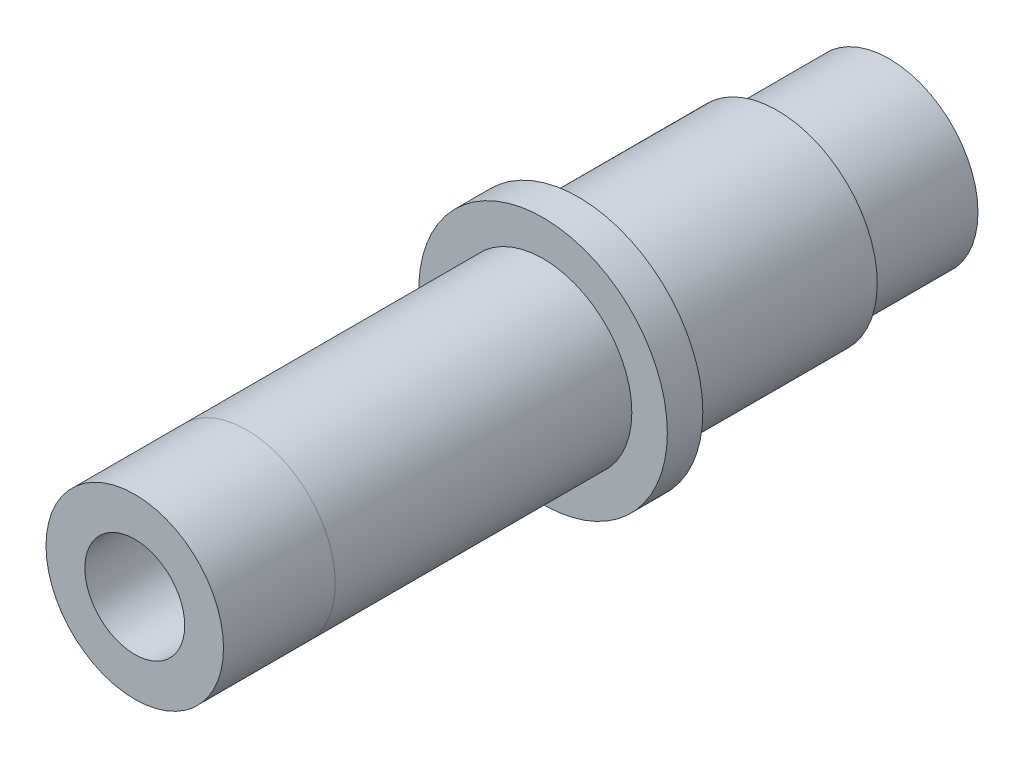
ISO-10303-21;
HEADER;
FILE_DESCRIPTION(('STEP AP214'),'2;1');
FILE_NAME('part.step','',(''),(''),'','','');
FILE_SCHEMA(('AUTOMOTIVE_DESIGN { 1 0 10303 214 1 1 1 1 }'));
ENDSEC;
DATA;
#1=APPLICATION_CONTEXT('core data for automotive mechanical design processes');
#2=APPLICATION_PROTOCOL_DEFINITION('international standard','automotive_design',2000,#1);
#3=PRODUCT_CONTEXT('',#1,'mechanical');
#4=PRODUCT('Part','Part','',(#3));
#5=PRODUCT_RELATED_PRODUCT_CATEGORY('part','',(#4));
#6=PRODUCT_DEFINITION_FORMATION('','',#4);
#7=PRODUCT_DEFINITION_CONTEXT('part definition',#1,'design');
#8=PRODUCT_DEFINITION('design','',#6,#7);
#9=PRODUCT_DEFINITION_SHAPE('','',#8);
#10=(LENGTH_UNIT() NAMED_UNIT(*) SI_UNIT(.MILLI.,.METRE.));
#11=(NAMED_UNIT(*) PLANE_ANGLE_UNIT() SI_UNIT($,.RADIAN.));
#12=(NAMED_UNIT(*) SI_UNIT($,.STERADIAN.) SOLID_ANGLE_UNIT());
#13=UNCERTAINTY_MEASURE_WITH_UNIT(LENGTH_MEASURE(1.E-05),#10,'distance_accuracy_value','');
#14=(GEOMETRIC_REPRESENTATION_CONTEXT(3) GLOBAL_UNCERTAINTY_ASSIGNED_CONTEXT((#13)) GLOBAL_UNIT_ASSIGNED_CONTEXT((#10,
#11,#12)) REPRESENTATION_CONTEXT('',''));
#15=CARTESIAN_POINT('',(0.,0.,0.));
#16=DIRECTION('',(0.,0.,1.));
#17=DIRECTION('',(1.,0.,0.));
#18=AXIS2_PLACEMENT_3D('',#15,#16,#17);
#19=CARTESIAN_POINT('',(0.,0.,-23.495));
#20=DIRECTION('',(0.,0.,1.));
#21=DIRECTION('',(1.,0.,0.));
#22=AXIS2_PLACEMENT_3D('',#19,#20,#21);
#23=CYLINDRICAL_SURFACE('',#22,6.35);
#24=CARTESIAN_POINT('',(0.,0.,30.48));
#25=DIRECTION('',(0.,0.,1.));
#26=DIRECTION('',(1.,0.,0.));
#27=AXIS2_PLACEMENT_3D('',#24,#25,#26);
#28=CIRCLE('',#27,6.35);
#29=CARTESIAN_POINT('',(6.35,0.,30.48));
#30=VERTEX_POINT('',#29);
#31=EDGE_CURVE('E81',#30,#30,#28,.T.);
#32=ORIENTED_EDGE('',*,*,#31,.F.);
#33=EDGE_LOOP('',(#32));
#34=FACE_BOUND('',#33,.T.);
#35=CARTESIAN_POINT('',(0.,0.,22.48));
#36=DIRECTION('',(0.,0.,-1.));
#37=DIRECTION('',(-1.,0.,0.));
#38=AXIS2_PLACEMENT_3D('',#35,#36,#37);
#39=CIRCLE('',#38,6.35);
#40=CARTESIAN_POINT('',(0.,6.35,22.48));
#41=VERTEX_POINT('',#40);
#42=CARTESIAN_POINT('',(0.,-6.35,22.48));
#43=VERTEX_POINT('',#42);
#44=EDGE_CURVE('E67',#41,#43,#39,.F.);
#45=ORIENTED_EDGE('',*,*,#44,.T.);
#46=EDGE_CURVE('E59',#43,#41,#39,.F.);
#47=ORIENTED_EDGE('',*,*,#46,.T.);
#48=EDGE_LOOP('',(#45,#47));
#49=FACE_BOUND('',#48,.T.);
#50=ADVANCED_FACE('F49',(#34,#49),#23,.T.);
#51=ORIENTED_EDGE('',*,*,#46,.F.);
#52=ORIENTED_EDGE('',*,*,#44,.F.);
#53=EDGE_LOOP('',(#51,#52));
#54=FACE_BOUND('',#53,.T.);
#55=CARTESIAN_POINT('',(0.,0.,1.27));
#56=DIRECTION('',(0.,0.,1.));
#57=DIRECTION('',(1.,0.,0.));
#58=AXIS2_PLACEMENT_3D('',#55,#56,#57);
#59=CIRCLE('',#58,6.35);
#60=CARTESIAN_POINT('',(6.35,0.,1.27));
#61=VERTEX_POINT('',#60);
#62=EDGE_CURVE('E72',#61,#61,#59,.F.);
#63=ORIENTED_EDGE('',*,*,#62,.F.);
#64=EDGE_LOOP('',(#63));
#65=FACE_BOUND('',#64,.T.);
#66=ADVANCED_FACE('F51',(#54,#65),#23,.T.);
#67=CARTESIAN_POINT('',(0.,0.,30.48));
#68=DIRECTION('',(0.,0.,1.));
#69=DIRECTION('',(1.,0.,0.));
#70=AXIS2_PLACEMENT_3D('',#67,#68,#69);
#71=PLANE('',#70);
#72=CARTESIAN_POINT('',(0.,0.,30.48));
#73=DIRECTION('',(0.,0.,1.));
#74=DIRECTION('',(1.,0.,0.));
#75=AXIS2_PLACEMENT_3D('',#72,#73,#74);
#76=CIRCLE('',#75,3.571875);
#77=CARTESIAN_POINT('',(3.571875,0.,30.48));
#78=VERTEX_POINT('',#77);
#79=EDGE_CURVE('E94',#78,#78,#76,.T.);
#80=ORIENTED_EDGE('',*,*,#79,.F.);
#81=EDGE_LOOP('',(#80));
#82=FACE_BOUND('',#81,.T.);
#83=ORIENTED_EDGE('',*,*,#31,.T.);
#84=EDGE_LOOP('',(#83));
#85=FACE_BOUND('',#84,.T.);
#86=ADVANCED_FACE('F110',(#82,#85),#71,.T.);
#87=CARTESIAN_POINT('',(0.,0.,1.27));
#88=DIRECTION('',(0.,0.,-1.));
#89=DIRECTION('',(-1.,0.,0.));
#90=AXIS2_PLACEMENT_3D('',#87,#88,#89);
#91=CYLINDRICAL_SURFACE('',#90,8.89);
#92=CARTESIAN_POINT('',(0.,0.,1.27));
#93=DIRECTION('',(0.,0.,1.));
#94=DIRECTION('',(1.,0.,0.));
#95=AXIS2_PLACEMENT_3D('',#92,#93,#94);
#96=CIRCLE('',#95,8.89);
#97=CARTESIAN_POINT('',(8.89,0.,1.27));
#98=VERTEX_POINT('',#97);
#99=EDGE_CURVE('E84',#98,#98,#96,.T.);
#100=ORIENTED_EDGE('',*,*,#99,.F.);
#101=EDGE_LOOP('',(#100));
#102=FACE_BOUND('',#101,.T.);
#103=CARTESIAN_POINT('',(0.,0.,-1.27));
#104=DIRECTION('',(0.,0.,1.));
#105=DIRECTION('',(1.,0.,0.));
#106=AXIS2_PLACEMENT_3D('',#103,#104,#105);
#107=CIRCLE('',#106,8.89);
#108=CARTESIAN_POINT('',(8.89,0.,-1.27));
#109=VERTEX_POINT('',#108);
#110=EDGE_CURVE('E85',#109,#109,#107,.T.);
#111=ORIENTED_EDGE('',*,*,#110,.T.);
#112=EDGE_LOOP('',(#111));
#113=FACE_BOUND('',#112,.T.);
#114=ADVANCED_FACE('F113',(#102,#113),#91,.T.);
#115=CARTESIAN_POINT('',(0.,0.,1.27));
#116=DIRECTION('',(0.,0.,1.));
#117=DIRECTION('',(1.,0.,0.));
#118=AXIS2_PLACEMENT_3D('',#115,#116,#117);
#119=PLANE('',#118);
#120=ORIENTED_EDGE('',*,*,#62,.T.);
#121=EDGE_LOOP('',(#120));
#122=FACE_BOUND('',#121,.T.);
#123=ORIENTED_EDGE('',*,*,#99,.T.);
#124=EDGE_LOOP('',(#123));
#125=FACE_BOUND('',#124,.T.);
#126=ADVANCED_FACE('F147',(#122,#125),#119,.T.);
#127=CARTESIAN_POINT('',(0.,0.,-1.27));
#128=DIRECTION('',(0.,0.,1.));
#129=DIRECTION('',(1.,0.,0.));
#130=AXIS2_PLACEMENT_3D('',#127,#128,#129);
#131=PLANE('',#130);
#132=CARTESIAN_POINT('',(0.,0.,-1.27));
#133=DIRECTION('',(0.,0.,1.));
#134=DIRECTION('',(1.,0.,0.));
#135=AXIS2_PLACEMENT_3D('',#132,#133,#134);
#136=CIRCLE('',#135,7.14375);
#137=CARTESIAN_POINT('',(7.14375,0.,-1.27));
#138=VERTEX_POINT('',#137);
#139=EDGE_CURVE('E53',#138,#138,#136,.T.);
#140=ORIENTED_EDGE('',*,*,#139,.T.);
#141=EDGE_LOOP('',(#140));
#142=FACE_BOUND('',#141,.T.);
#143=ORIENTED_EDGE('',*,*,#110,.F.);
#144=EDGE_LOOP('',(#143));
#145=FACE_BOUND('',#144,.T.);
#146=ADVANCED_FACE('F140',(#142,#145),#131,.F.);
#147=CARTESIAN_POINT('',(0.,0.,-15.495));
#148=DIRECTION('',(0.,0.,1.));
#149=DIRECTION('',(1.,0.,0.));
#150=AXIS2_PLACEMENT_3D('',#147,#148,#149);
#151=CYLINDRICAL_SURFACE('',#150,7.14375);
#152=CARTESIAN_POINT('',(0.,0.,-15.495));
#153=DIRECTION('',(0.,0.,1.));
#154=DIRECTION('',(1.,0.,0.));
#155=AXIS2_PLACEMENT_3D('',#152,#153,#154);
#156=CIRCLE('',#155,7.14375);
#157=CARTESIAN_POINT('',(7.14375,0.,-15.495));
#158=VERTEX_POINT('',#157);
#159=EDGE_CURVE('E90',#158,#158,#156,.T.);
#160=CARTESIAN_POINT('',(7.14375,0.,-15.495));
#161=CARTESIAN_POINT('',(7.14375,0.,-15.3468229166667));
#162=CARTESIAN_POINT('',(7.14375,0.,-15.1986458333333));
#163=CARTESIAN_POINT('',(7.14375,0.,-14.9022916666667));
#164=CARTESIAN_POINT('',(7.14375,0.,-14.7541145833333));
#165=CARTESIAN_POINT('',(7.14375,0.,-14.4577604166667));
#166=CARTESIAN_POINT('',(7.14375,0.,-14.3095833333333));
#167=CARTESIAN_POINT('',(7.14375,0.,-14.0132291666667));
#168=CARTESIAN_POINT('',(7.14375,0.,-13.8650520833333));
#169=CARTESIAN_POINT('',(7.14375,0.,-13.5686979166667));
#170=CARTESIAN_POINT('',(7.14375,0.,-13.4205208333333));
#171=CARTESIAN_POINT('',(7.14375,0.,-13.1241666666667));
#172=CARTESIAN_POINT('',(7.14375,0.,-12.9759895833333));
#173=CARTESIAN_POINT('',(7.14375,0.,-12.6796354166667));
#174=CARTESIAN_POINT('',(7.14375,0.,-12.5314583333333));
#175=CARTESIAN_POINT('',(7.14375,0.,-12.2351041666667));
#176=CARTESIAN_POINT('',(7.14375,0.,-12.0869270833333));
#177=CARTESIAN_POINT('',(7.14375,0.,-11.7905729166667));
#178=CARTESIAN_POINT('',(7.14375,0.,-11.6423958333333));
#179=CARTESIAN_POINT('',(7.14375,0.,-11.3460416666667));
#180=CARTESIAN_POINT('',(7.14375,0.,-11.1978645833333));
#181=CARTESIAN_POINT('',(7.14375,0.,-10.9015104166667));
#182=CARTESIAN_POINT('',(7.14375,0.,-10.7533333333333));
#183=CARTESIAN_POINT('',(7.14375,0.,-10.4569791666667));
#184=CARTESIAN_POINT('',(7.14375,0.,-10.3088020833333));
#185=CARTESIAN_POINT('',(7.14375,0.,-10.0124479166667));
#186=CARTESIAN_POINT('',(7.14375,0.,-9.86427083333334));
#187=CARTESIAN_POINT('',(7.14375,0.,-9.56791666666667));
#188=CARTESIAN_POINT('',(7.14375,0.,-9.41973958333334));
#189=CARTESIAN_POINT('',(7.14375,0.,-9.12338541666667));
#190=CARTESIAN_POINT('',(7.14375,0.,-8.97520833333334));
#191=CARTESIAN_POINT('',(7.14375,0.,-8.67885416666667));
#192=CARTESIAN_POINT('',(7.14375,0.,-8.53067708333334));
#193=CARTESIAN_POINT('',(7.14375,0.,-8.23432291666667));
#194=CARTESIAN_POINT('',(7.14375,0.,-8.08614583333334));
#195=CARTESIAN_POINT('',(7.14375,0.,-7.78979166666667));
#196=CARTESIAN_POINT('',(7.14375,0.,-7.64161458333334));
#197=CARTESIAN_POINT('',(7.14375,0.,-7.34526041666667));
#198=CARTESIAN_POINT('',(7.14375,0.,-7.19708333333334));
#199=CARTESIAN_POINT('',(7.14375,0.,-6.90072916666667));
#200=CARTESIAN_POINT('',(7.14375,0.,-6.75255208333334));
#201=CARTESIAN_POINT('',(7.14375,0.,-6.45619791666667));
#202=CARTESIAN_POINT('',(7.14375,0.,-6.30802083333334));
#203=CARTESIAN_POINT('',(7.14375,0.,-6.01166666666667));
#204=CARTESIAN_POINT('',(7.14375,0.,-5.86348958333333));
#205=CARTESIAN_POINT('',(7.14375,0.,-5.56713541666667));
#206=CARTESIAN_POINT('',(7.14375,0.,-5.41895833333334));
#207=CARTESIAN_POINT('',(7.14375,0.,-5.12260416666667));
#208=CARTESIAN_POINT('',(7.14375,0.,-4.97442708333334));
#209=CARTESIAN_POINT('',(7.14375,0.,-4.67807291666667));
#210=CARTESIAN_POINT('',(7.14375,0.,-4.52989583333334));
#211=CARTESIAN_POINT('',(7.14375,0.,-4.23354166666667));
#212=CARTESIAN_POINT('',(7.14375,0.,-4.08536458333334));
#213=CARTESIAN_POINT('',(7.14375,0.,-3.78901041666667));
#214=CARTESIAN_POINT('',(7.14375,0.,-3.64083333333334));
#215=CARTESIAN_POINT('',(7.14375,0.,-3.34447916666667));
#216=CARTESIAN_POINT('',(7.14375,0.,-3.19630208333334));
#217=CARTESIAN_POINT('',(7.14375,0.,-2.89994791666667));
#218=CARTESIAN_POINT('',(7.14375,0.,-2.75177083333334));
#219=CARTESIAN_POINT('',(7.14375,0.,-2.45541666666667));
#220=CARTESIAN_POINT('',(7.14375,0.,-2.30723958333334));
#221=CARTESIAN_POINT('',(7.14375,0.,-2.01088541666667));
#222=CARTESIAN_POINT('',(7.14375,0.,-1.86270833333333));
#223=CARTESIAN_POINT('',(7.14375,0.,-1.56635416666667));
#224=CARTESIAN_POINT('',(7.14375,0.,-1.41817708333334));
#225=CARTESIAN_POINT('',(7.14375,0.,-1.27));
#226=B_SPLINE_CURVE_WITH_KNOTS('',3,(#160,#161,#162,#163,#164,#165,#166,#167,#168,#169,#170,
#171,#172,#173,#174,#175,#176,#177,#178,#179,#180,#181,#182,#183,#184,#185,#186,#187,#188,#189,
#190,#191,#192,#193,#194,#195,#196,#197,#198,#199,#200,#201,#202,#203,#204,#205,#206,#207,#208,
#209,#210,#211,#212,#213,#214,#215,#216,#217,#218,#219,#220,#221,#222,#223,#224,#225),
.UNSPECIFIED.,.F.,.F.,(4,2,2,2,2,2,2,2,2,2,2,2,2,2,2,2,2,2,2,2,2,2,2,2,2,2,2,2,2,2,2,2,4),(0.,
0.44453125,0.889062499999999,1.33359375,1.778125,2.22265625,2.6671875,3.11171875,3.55625,
4.00078125,4.4453125,4.88984375,5.334375,5.77890625,6.2234375,6.66796875,7.1125,7.55703125,
8.0015625,8.44609375,8.890625,9.33515625,9.7796875,10.22421875,10.66875,11.11328125,11.5578125,
12.00234375,12.446875,12.89140625,13.3359375,13.78046875,14.225),.UNSPECIFIED.);
#227=EDGE_CURVE('BSEAM134',#158,#138,#226,.T.);
#228=ORIENTED_EDGE('',*,*,#159,.T.);
#229=ORIENTED_EDGE('',*,*,#139,.F.);
#230=ORIENTED_EDGE('',*,*,#227,.T.);
#231=ORIENTED_EDGE('',*,*,#227,.F.);
#232=EDGE_LOOP('',(#228,#230,#229,#231));
#233=FACE_BOUND('',#232,.T.);
#234=ADVANCED_FACE('F134',(#233),#151,.T.);
#235=CARTESIAN_POINT('',(0.,0.,-15.495));
#236=DIRECTION('',(0.,0.,1.));
#237=DIRECTION('',(1.,0.,0.));
#238=AXIS2_PLACEMENT_3D('',#235,#236,#237);
#239=PLANE('',#238);
#240=CARTESIAN_POINT('',(0.,0.,-15.495));
#241=DIRECTION('',(0.,0.,1.));
#242=DIRECTION('',(1.,0.,0.));
#243=AXIS2_PLACEMENT_3D('',#240,#241,#242);
#244=CIRCLE('',#243,6.35);
#245=CARTESIAN_POINT('',(6.35,0.,-15.495));
#246=VERTEX_POINT('',#245);
#247=EDGE_CURVE('E11',#246,#246,#244,.F.);
#248=ORIENTED_EDGE('',*,*,#247,.F.);
#249=EDGE_LOOP('',(#248));
#250=FACE_BOUND('',#249,.T.);
#251=ORIENTED_EDGE('',*,*,#159,.F.);
#252=EDGE_LOOP('',(#251));
#253=FACE_BOUND('',#252,.T.);
#254=ADVANCED_FACE('F128',(#250,#253),#239,.F.);
#255=CARTESIAN_POINT('',(0.,0.,-23.495));
#256=DIRECTION('',(0.,0.,1.));
#257=DIRECTION('',(1.,0.,0.));
#258=AXIS2_PLACEMENT_3D('',#255,#256,#257);
#259=PLANE('',#258);
#260=CARTESIAN_POINT('',(0.,0.,-23.495));
#261=DIRECTION('',(0.,0.,1.));
#262=DIRECTION('',(1.,0.,0.));
#263=AXIS2_PLACEMENT_3D('',#260,#261,#262);
#264=CIRCLE('',#263,3.571875);
#265=CARTESIAN_POINT('',(3.571875,0.,-23.495));
#266=VERTEX_POINT('',#265);
#267=EDGE_CURVE('E93',#266,#266,#264,.T.);
#268=ORIENTED_EDGE('',*,*,#267,.T.);
#269=EDGE_LOOP('',(#268));
#270=FACE_BOUND('',#269,.T.);
#271=CARTESIAN_POINT('',(0.,0.,-23.495));
#272=DIRECTION('',(0.,0.,1.));
#273=DIRECTION('',(1.,0.,0.));
#274=AXIS2_PLACEMENT_3D('',#271,#272,#273);
#275=CIRCLE('',#274,6.35);
#276=CARTESIAN_POINT('',(6.35,0.,-23.495));
#277=VERTEX_POINT('',#276);
#278=EDGE_CURVE('E76',#277,#277,#275,.T.);
#279=ORIENTED_EDGE('',*,*,#278,.F.);
#280=EDGE_LOOP('',(#279));
#281=FACE_BOUND('',#280,.T.);
#282=ADVANCED_FACE('F100',(#270,#281),#259,.F.);
#283=ORIENTED_EDGE('',*,*,#278,.T.);
#284=EDGE_LOOP('',(#283));
#285=FACE_BOUND('',#284,.T.);
#286=ORIENTED_EDGE('',*,*,#247,.T.);
#287=EDGE_LOOP('',(#286));
#288=FACE_BOUND('',#287,.T.);
#289=ADVANCED_FACE('F106',(#285,#288),#23,.T.);
#290=CARTESIAN_POINT('',(0.,0.,-23.495));
#291=DIRECTION('',(0.,0.,1.));
#292=DIRECTION('',(1.,0.,0.));
#293=AXIS2_PLACEMENT_3D('',#290,#291,#292);
#294=CYLINDRICAL_SURFACE('',#293,3.571875);
#295=ORIENTED_EDGE('',*,*,#267,.F.);
#296=EDGE_LOOP('',(#295));
#297=FACE_BOUND('',#296,.T.);
#298=ORIENTED_EDGE('',*,*,#79,.T.);
#299=EDGE_LOOP('',(#298));
#300=FACE_BOUND('',#299,.T.);
#301=ADVANCED_FACE('F103',(#297,#300),#294,.F.);
#302=CLOSED_SHELL('',(#50,#66,#86,#114,#126,#146,#234,#254,#282,#289,#301));
#303=MANIFOLD_SOLID_BREP('B2',#302);
#304=ADVANCED_BREP_SHAPE_REPRESENTATION('',(#18,#303),#14);
#305=SHAPE_DEFINITION_REPRESENTATION(#9,#304);
ENDSEC;
END-ISO-10303-21;
